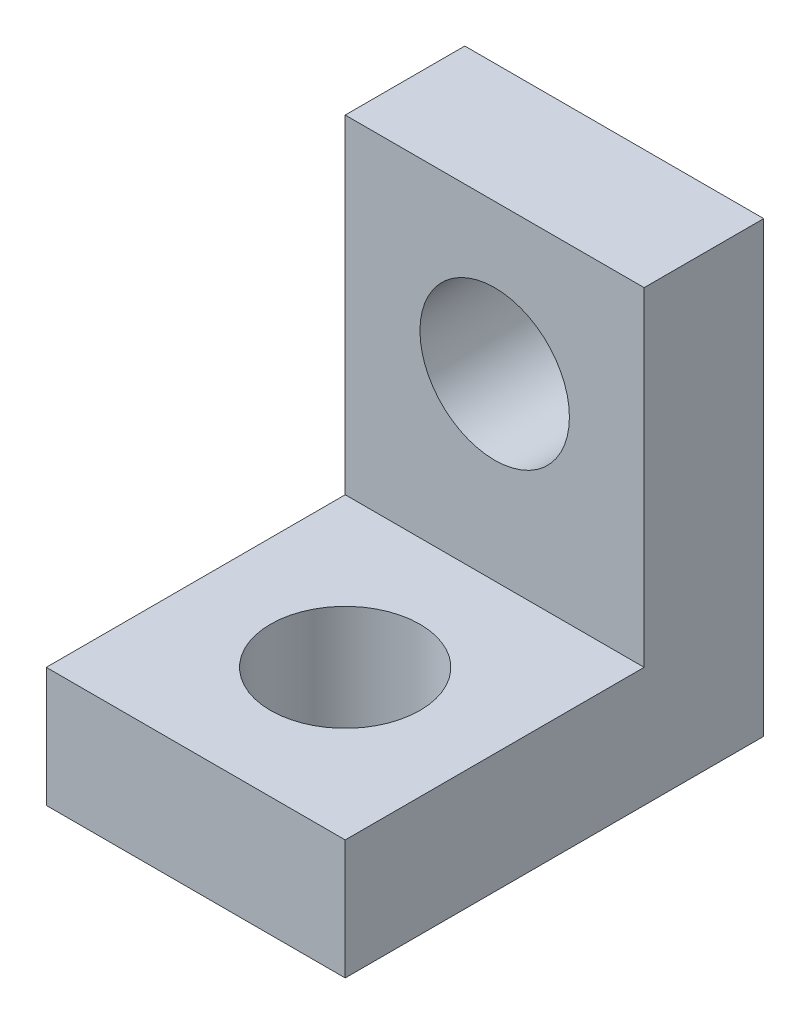
ISO-10303-21;
HEADER;
FILE_DESCRIPTION(('STEP AP214'),'2;1');
FILE_NAME('part.step','',(''),(''),'','','');
FILE_SCHEMA(('AUTOMOTIVE_DESIGN { 1 0 10303 214 1 1 1 1 }'));
ENDSEC;
DATA;
#1=APPLICATION_CONTEXT('core data for automotive mechanical design processes');
#2=APPLICATION_PROTOCOL_DEFINITION('international standard','automotive_design',2000,#1);
#3=PRODUCT_CONTEXT('',#1,'mechanical');
#4=PRODUCT('Part','Part','',(#3));
#5=PRODUCT_RELATED_PRODUCT_CATEGORY('part','',(#4));
#6=PRODUCT_DEFINITION_FORMATION('','',#4);
#7=PRODUCT_DEFINITION_CONTEXT('part definition',#1,'design');
#8=PRODUCT_DEFINITION('design','',#6,#7);
#9=PRODUCT_DEFINITION_SHAPE('','',#8);
#10=(LENGTH_UNIT() NAMED_UNIT(*) SI_UNIT(.MILLI.,.METRE.));
#11=(NAMED_UNIT(*) PLANE_ANGLE_UNIT() SI_UNIT($,.RADIAN.));
#12=(NAMED_UNIT(*) SI_UNIT($,.STERADIAN.) SOLID_ANGLE_UNIT());
#13=UNCERTAINTY_MEASURE_WITH_UNIT(LENGTH_MEASURE(1.E-05),#10,'distance_accuracy_value','');
#14=(GEOMETRIC_REPRESENTATION_CONTEXT(3) GLOBAL_UNCERTAINTY_ASSIGNED_CONTEXT((#13)) GLOBAL_UNIT_ASSIGNED_CONTEXT((#10,
#11,#12)) REPRESENTATION_CONTEXT('',''));
#15=CARTESIAN_POINT('',(0.,0.,0.));
#16=DIRECTION('',(0.,0.,1.));
#17=DIRECTION('',(1.,0.,0.));
#18=AXIS2_PLACEMENT_3D('',#15,#16,#17);
#19=CARTESIAN_POINT('',(0.,0.,4.));
#20=DIRECTION('',(0.,0.,-1.));
#21=DIRECTION('',(-1.,0.,0.));
#22=AXIS2_PLACEMENT_3D('',#19,#20,#21);
#23=PLANE('',#22);
#24=CARTESIAN_POINT('',(0.,2.5,4.));
#25=DIRECTION('',(0.,0.,1.));
#26=DIRECTION('',(1.,0.,0.));
#27=AXIS2_PLACEMENT_3D('',#24,#25,#26);
#28=CIRCLE('',#27,2.5);
#29=CARTESIAN_POINT('',(2.5,2.5,4.));
#30=VERTEX_POINT('',#29);
#31=EDGE_CURVE('E103',#30,#30,#28,.T.);
#32=ORIENTED_EDGE('',*,*,#31,.F.);
#33=EDGE_LOOP('',(#32));
#34=FACE_BOUND('',#33,.T.);
#35=DIRECTION('',(-1.,0.,0.));
#36=VECTOR('',#35,1.);
#37=CARTESIAN_POINT('',(-5.,-3.5,4.));
#38=LINE('',#37,#36);
#39=CARTESIAN_POINT('',(5.,-3.5,4.));
#40=VERTEX_POINT('',#39);
#41=CARTESIAN_POINT('',(-5.,-3.5,4.));
#42=VERTEX_POINT('',#41);
#43=EDGE_CURVE('E49',#40,#42,#38,.T.);
#44=ORIENTED_EDGE('',*,*,#43,.F.);
#45=DIRECTION('',(0.,1.,0.));
#46=VECTOR('',#45,1.);
#47=CARTESIAN_POINT('',(5.,-7.5,4.));
#48=LINE('',#47,#46);
#49=CARTESIAN_POINT('',(5.,7.5,4.));
#50=VERTEX_POINT('',#49);
#51=EDGE_CURVE('E87',#40,#50,#48,.T.);
#52=ORIENTED_EDGE('',*,*,#51,.T.);
#53=DIRECTION('',(-1.,0.,0.));
#54=VECTOR('',#53,1.);
#55=CARTESIAN_POINT('',(-5.,7.5,4.));
#56=LINE('',#55,#54);
#57=CARTESIAN_POINT('',(-5.,7.5,4.));
#58=VERTEX_POINT('',#57);
#59=EDGE_CURVE('E55',#50,#58,#56,.T.);
#60=ORIENTED_EDGE('',*,*,#59,.T.);
#61=DIRECTION('',(0.,-1.,0.));
#62=VECTOR('',#61,1.);
#63=CARTESIAN_POINT('',(-5.,-7.5,4.));
#64=LINE('',#63,#62);
#65=EDGE_CURVE('E98',#58,#42,#64,.T.);
#66=ORIENTED_EDGE('',*,*,#65,.T.);
#67=EDGE_LOOP('',(#44,#52,#60,#66));
#68=FACE_BOUND('',#67,.T.);
#69=ADVANCED_FACE('F34',(#34,#68),#23,.F.);
#70=CARTESIAN_POINT('',(0.,0.,0.));
#71=DIRECTION('',(0.,0.,-1.));
#72=DIRECTION('',(-1.,0.,0.));
#73=AXIS2_PLACEMENT_3D('',#70,#71,#72);
#74=PLANE('',#73);
#75=DIRECTION('',(0.,1.,0.));
#76=VECTOR('',#75,1.);
#77=CARTESIAN_POINT('',(5.,-7.5,0.));
#78=LINE('',#77,#76);
#79=CARTESIAN_POINT('',(5.,-7.5,0.));
#80=VERTEX_POINT('',#79);
#81=CARTESIAN_POINT('',(5.,7.5,0.));
#82=VERTEX_POINT('',#81);
#83=EDGE_CURVE('E94',#80,#82,#78,.T.);
#84=ORIENTED_EDGE('',*,*,#83,.F.);
#85=DIRECTION('',(1.,0.,0.));
#86=VECTOR('',#85,1.);
#87=CARTESIAN_POINT('',(-5.,-7.5,0.));
#88=LINE('',#87,#86);
#89=CARTESIAN_POINT('',(-5.,-7.5,0.));
#90=VERTEX_POINT('',#89);
#91=EDGE_CURVE('E75',#90,#80,#88,.T.);
#92=ORIENTED_EDGE('',*,*,#91,.F.);
#93=DIRECTION('',(0.,-1.,0.));
#94=VECTOR('',#93,1.);
#95=CARTESIAN_POINT('',(-5.,-7.5,0.));
#96=LINE('',#95,#94);
#97=CARTESIAN_POINT('',(-5.,7.5,0.));
#98=VERTEX_POINT('',#97);
#99=EDGE_CURVE('E88',#98,#90,#96,.T.);
#100=ORIENTED_EDGE('',*,*,#99,.F.);
#101=DIRECTION('',(-1.,0.,0.));
#102=VECTOR('',#101,1.);
#103=CARTESIAN_POINT('',(-5.,7.5,0.));
#104=LINE('',#103,#102);
#105=EDGE_CURVE('E102',#82,#98,#104,.T.);
#106=ORIENTED_EDGE('',*,*,#105,.F.);
#107=EDGE_LOOP('',(#84,#92,#100,#106));
#108=FACE_BOUND('',#107,.T.);
#109=CARTESIAN_POINT('',(0.,2.5,0.));
#110=DIRECTION('',(0.,0.,1.));
#111=DIRECTION('',(1.,0.,0.));
#112=AXIS2_PLACEMENT_3D('',#109,#110,#111);
#113=CIRCLE('',#112,2.5);
#114=CARTESIAN_POINT('',(2.5,2.5,0.));
#115=VERTEX_POINT('',#114);
#116=EDGE_CURVE('E107',#115,#115,#113,.T.);
#117=ORIENTED_EDGE('',*,*,#116,.T.);
#118=EDGE_LOOP('',(#117));
#119=FACE_BOUND('',#118,.T.);
#120=ADVANCED_FACE('F100',(#108,#119),#74,.T.);
#121=CARTESIAN_POINT('',(5.,-7.5,4.));
#122=DIRECTION('',(-1.,0.,0.));
#123=DIRECTION('',(0.,0.,1.));
#124=AXIS2_PLACEMENT_3D('',#121,#122,#123);
#125=PLANE('',#124);
#126=ORIENTED_EDGE('',*,*,#83,.T.);
#127=DIRECTION('',(0.,0.,-1.));
#128=VECTOR('',#127,1.);
#129=CARTESIAN_POINT('',(5.,7.5,4.));
#130=LINE('',#129,#128);
#131=EDGE_CURVE('E11',#50,#82,#130,.T.);
#132=ORIENTED_EDGE('',*,*,#131,.F.);
#133=ORIENTED_EDGE('',*,*,#51,.F.);
#134=DIRECTION('',(0.,0.,-1.));
#135=VECTOR('',#134,1.);
#136=CARTESIAN_POINT('',(5.,-3.5,14.));
#137=LINE('',#136,#135);
#138=CARTESIAN_POINT('',(5.,-3.5,14.));
#139=VERTEX_POINT('',#138);
#140=EDGE_CURVE('E122',#139,#40,#137,.T.);
#141=ORIENTED_EDGE('',*,*,#140,.F.);
#142=DIRECTION('',(0.,1.,0.));
#143=VECTOR('',#142,1.);
#144=CARTESIAN_POINT('',(5.,-7.5,14.));
#145=LINE('',#144,#143);
#146=CARTESIAN_POINT('',(5.,-7.5,14.));
#147=VERTEX_POINT('',#146);
#148=EDGE_CURVE('E97',#147,#139,#145,.T.);
#149=ORIENTED_EDGE('',*,*,#148,.F.);
#150=DIRECTION('',(0.,0.,-1.));
#151=VECTOR('',#150,1.);
#152=CARTESIAN_POINT('',(5.,-7.5,4.));
#153=LINE('',#152,#151);
#154=EDGE_CURVE('E80',#147,#80,#153,.T.);
#155=ORIENTED_EDGE('',*,*,#154,.T.);
#156=EDGE_LOOP('',(#126,#132,#133,#141,#149,#155));
#157=FACE_BOUND('',#156,.T.);
#158=ADVANCED_FACE('F36',(#157),#125,.F.);
#159=CARTESIAN_POINT('',(-5.,7.5,4.));
#160=DIRECTION('',(0.,-1.,0.));
#161=DIRECTION('',(0.,0.,-1.));
#162=AXIS2_PLACEMENT_3D('',#159,#160,#161);
#163=PLANE('',#162);
#164=ORIENTED_EDGE('',*,*,#105,.T.);
#165=DIRECTION('',(0.,0.,-1.));
#166=VECTOR('',#165,1.);
#167=CARTESIAN_POINT('',(-5.,7.5,4.));
#168=LINE('',#167,#166);
#169=EDGE_CURVE('E42',#58,#98,#168,.T.);
#170=ORIENTED_EDGE('',*,*,#169,.F.);
#171=ORIENTED_EDGE('',*,*,#59,.F.);
#172=ORIENTED_EDGE('',*,*,#131,.T.);
#173=EDGE_LOOP('',(#164,#170,#171,#172));
#174=FACE_BOUND('',#173,.T.);
#175=ADVANCED_FACE('F119',(#174),#163,.F.);
#176=CARTESIAN_POINT('',(-5.,-7.5,4.));
#177=DIRECTION('',(1.,0.,0.));
#178=DIRECTION('',(0.,0.,-1.));
#179=AXIS2_PLACEMENT_3D('',#176,#177,#178);
#180=PLANE('',#179);
#181=ORIENTED_EDGE('',*,*,#99,.T.);
#182=DIRECTION('',(0.,0.,-1.));
#183=VECTOR('',#182,1.);
#184=CARTESIAN_POINT('',(-5.,-7.5,4.));
#185=LINE('',#184,#183);
#186=CARTESIAN_POINT('',(-5.,-7.5,14.));
#187=VERTEX_POINT('',#186);
#188=EDGE_CURVE('E83',#187,#90,#185,.T.);
#189=ORIENTED_EDGE('',*,*,#188,.F.);
#190=DIRECTION('',(0.,-1.,0.));
#191=VECTOR('',#190,1.);
#192=CARTESIAN_POINT('',(-5.,-7.5,14.));
#193=LINE('',#192,#191);
#194=CARTESIAN_POINT('',(-5.,-3.5,14.));
#195=VERTEX_POINT('',#194);
#196=EDGE_CURVE('E148',#195,#187,#193,.T.);
#197=ORIENTED_EDGE('',*,*,#196,.F.);
#198=DIRECTION('',(0.,0.,-1.));
#199=VECTOR('',#198,1.);
#200=CARTESIAN_POINT('',(-5.,-3.5,14.));
#201=LINE('',#200,#199);
#202=EDGE_CURVE('E131',#195,#42,#201,.T.);
#203=ORIENTED_EDGE('',*,*,#202,.T.);
#204=ORIENTED_EDGE('',*,*,#65,.F.);
#205=ORIENTED_EDGE('',*,*,#169,.T.);
#206=EDGE_LOOP('',(#181,#189,#197,#203,#204,#205));
#207=FACE_BOUND('',#206,.T.);
#208=ADVANCED_FACE('F116',(#207),#180,.F.);
#209=CARTESIAN_POINT('',(-5.,-7.5,4.));
#210=DIRECTION('',(0.,1.,0.));
#211=DIRECTION('',(0.,0.,1.));
#212=AXIS2_PLACEMENT_3D('',#209,#210,#211);
#213=PLANE('',#212);
#214=CARTESIAN_POINT('',(0.,-7.5,9.));
#215=DIRECTION('',(0.,1.,0.));
#216=DIRECTION('',(0.,0.,1.));
#217=AXIS2_PLACEMENT_3D('',#214,#215,#216);
#218=CIRCLE('',#217,2.5);
#219=CARTESIAN_POINT('',(0.,-7.5,11.5));
#220=VERTEX_POINT('',#219);
#221=EDGE_CURVE('E151',#220,#220,#218,.T.);
#222=ORIENTED_EDGE('',*,*,#221,.T.);
#223=EDGE_LOOP('',(#222));
#224=FACE_BOUND('',#223,.T.);
#225=ORIENTED_EDGE('',*,*,#91,.T.);
#226=ORIENTED_EDGE('',*,*,#154,.F.);
#227=DIRECTION('',(1.,0.,0.));
#228=VECTOR('',#227,1.);
#229=CARTESIAN_POINT('',(-5.,-7.5,14.));
#230=LINE('',#229,#228);
#231=EDGE_CURVE('E145',#187,#147,#230,.T.);
#232=ORIENTED_EDGE('',*,*,#231,.F.);
#233=ORIENTED_EDGE('',*,*,#188,.T.);
#234=EDGE_LOOP('',(#225,#226,#232,#233));
#235=FACE_BOUND('',#234,.T.);
#236=ADVANCED_FACE('F77',(#224,#235),#213,.F.);
#237=CARTESIAN_POINT('',(0.,2.5,4.));
#238=DIRECTION('',(0.,0.,-1.));
#239=DIRECTION('',(-1.,0.,0.));
#240=AXIS2_PLACEMENT_3D('',#237,#238,#239);
#241=CYLINDRICAL_SURFACE('',#240,2.5);
#242=ORIENTED_EDGE('',*,*,#31,.T.);
#243=EDGE_LOOP('',(#242));
#244=FACE_BOUND('',#243,.T.);
#245=ORIENTED_EDGE('',*,*,#116,.F.);
#246=EDGE_LOOP('',(#245));
#247=FACE_BOUND('',#246,.T.);
#248=ADVANCED_FACE('F165',(#244,#247),#241,.F.);
#249=CARTESIAN_POINT('',(-5.,-3.5,14.));
#250=DIRECTION('',(0.,-1.,0.));
#251=DIRECTION('',(0.,0.,-1.));
#252=AXIS2_PLACEMENT_3D('',#249,#250,#251);
#253=PLANE('',#252);
#254=CARTESIAN_POINT('',(0.,-3.5,9.));
#255=DIRECTION('',(0.,1.,0.));
#256=DIRECTION('',(0.,0.,1.));
#257=AXIS2_PLACEMENT_3D('',#254,#255,#256);
#258=CIRCLE('',#257,2.5);
#259=CARTESIAN_POINT('',(0.,-3.5,11.5));
#260=VERTEX_POINT('',#259);
#261=EDGE_CURVE('E153',#260,#260,#258,.T.);
#262=ORIENTED_EDGE('',*,*,#261,.F.);
#263=EDGE_LOOP('',(#262));
#264=FACE_BOUND('',#263,.T.);
#265=ORIENTED_EDGE('',*,*,#43,.T.);
#266=ORIENTED_EDGE('',*,*,#202,.F.);
#267=DIRECTION('',(-1.,0.,0.));
#268=VECTOR('',#267,1.);
#269=CARTESIAN_POINT('',(-5.,-3.5,14.));
#270=LINE('',#269,#268);
#271=EDGE_CURVE('E130',#139,#195,#270,.T.);
#272=ORIENTED_EDGE('',*,*,#271,.F.);
#273=ORIENTED_EDGE('',*,*,#140,.T.);
#274=EDGE_LOOP('',(#265,#266,#272,#273));
#275=FACE_BOUND('',#274,.T.);
#276=ADVANCED_FACE('F126',(#264,#275),#253,.F.);
#277=CARTESIAN_POINT('',(0.,0.,14.));
#278=DIRECTION('',(0.,0.,-1.));
#279=DIRECTION('',(-1.,0.,0.));
#280=AXIS2_PLACEMENT_3D('',#277,#278,#279);
#281=PLANE('',#280);
#282=ORIENTED_EDGE('',*,*,#196,.T.);
#283=ORIENTED_EDGE('',*,*,#231,.T.);
#284=ORIENTED_EDGE('',*,*,#148,.T.);
#285=ORIENTED_EDGE('',*,*,#271,.T.);
#286=EDGE_LOOP('',(#282,#283,#284,#285));
#287=FACE_BOUND('',#286,.T.);
#288=ADVANCED_FACE('F144',(#287),#281,.F.);
#289=CARTESIAN_POINT('',(0.,-13.5,9.));
#290=DIRECTION('',(0.,1.,0.));
#291=DIRECTION('',(0.,0.,1.));
#292=AXIS2_PLACEMENT_3D('',#289,#290,#291);
#293=CYLINDRICAL_SURFACE('',#292,2.5);
#294=ORIENTED_EDGE('',*,*,#261,.T.);
#295=EDGE_LOOP('',(#294));
#296=FACE_BOUND('',#295,.T.);
#297=ORIENTED_EDGE('',*,*,#221,.F.);
#298=EDGE_LOOP('',(#297));
#299=FACE_BOUND('',#298,.T.);
#300=ADVANCED_FACE('F161',(#296,#299),#293,.F.);
#301=CLOSED_SHELL('',(#69,#120,#158,#175,#208,#236,#248,#276,#288,#300));
#302=MANIFOLD_SOLID_BREP('B2',#301);
#303=ADVANCED_BREP_SHAPE_REPRESENTATION('',(#18,#302),#14);
#304=SHAPE_DEFINITION_REPRESENTATION(#9,#303);
ENDSEC;
END-ISO-10303-21;
